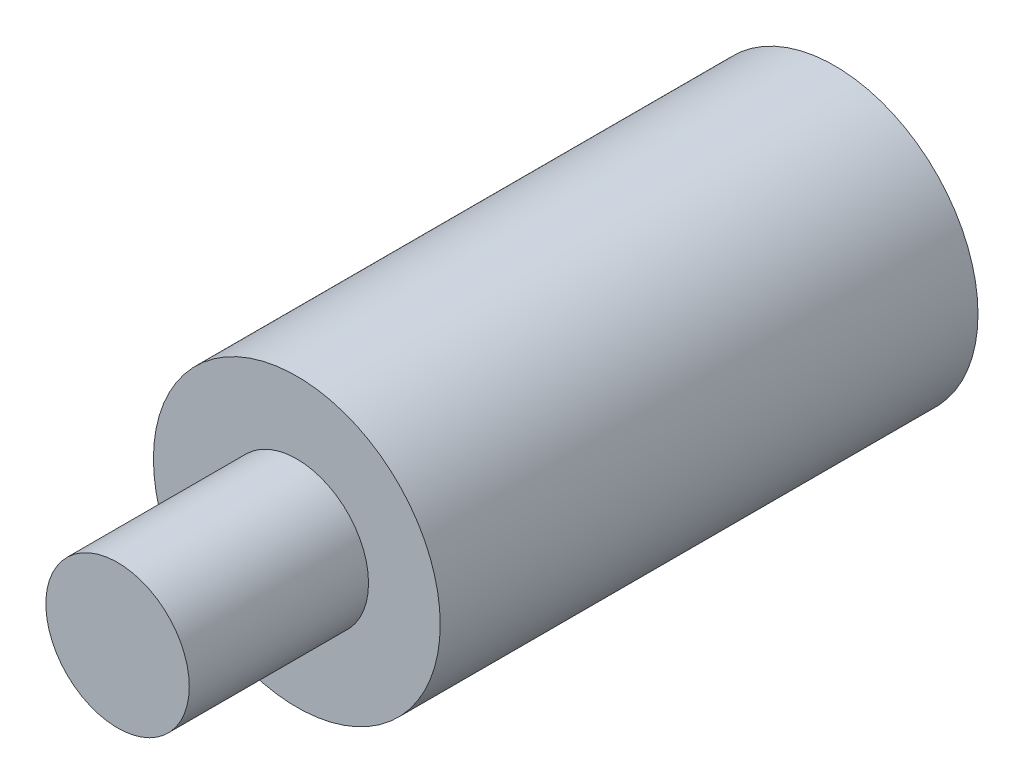
ISO-10303-21;
HEADER;
FILE_DESCRIPTION(('STEP AP214'),'2;1');
FILE_NAME('part.step','',(''),(''),'','','');
FILE_SCHEMA(('AUTOMOTIVE_DESIGN { 1 0 10303 214 1 1 1 1 }'));
ENDSEC;
DATA;
#1=APPLICATION_CONTEXT('core data for automotive mechanical design processes');
#2=APPLICATION_PROTOCOL_DEFINITION('international standard','automotive_design',2000,#1);
#3=PRODUCT_CONTEXT('',#1,'mechanical');
#4=PRODUCT('Part','Part','',(#3));
#5=PRODUCT_RELATED_PRODUCT_CATEGORY('part','',(#4));
#6=PRODUCT_DEFINITION_FORMATION('','',#4);
#7=PRODUCT_DEFINITION_CONTEXT('part definition',#1,'design');
#8=PRODUCT_DEFINITION('design','',#6,#7);
#9=PRODUCT_DEFINITION_SHAPE('','',#8);
#10=(LENGTH_UNIT() NAMED_UNIT(*) SI_UNIT(.MILLI.,.METRE.));
#11=(NAMED_UNIT(*) PLANE_ANGLE_UNIT() SI_UNIT($,.RADIAN.));
#12=(NAMED_UNIT(*) SI_UNIT($,.STERADIAN.) SOLID_ANGLE_UNIT());
#13=UNCERTAINTY_MEASURE_WITH_UNIT(LENGTH_MEASURE(1.E-05),#10,'distance_accuracy_value','');
#14=(GEOMETRIC_REPRESENTATION_CONTEXT(3) GLOBAL_UNCERTAINTY_ASSIGNED_CONTEXT((#13)) GLOBAL_UNIT_ASSIGNED_CONTEXT((#10,
#11,#12)) REPRESENTATION_CONTEXT('',''));
#15=CARTESIAN_POINT('',(0.,0.,0.));
#16=DIRECTION('',(0.,0.,1.));
#17=DIRECTION('',(1.,0.,0.));
#18=AXIS2_PLACEMENT_3D('',#15,#16,#17);
#19=CARTESIAN_POINT('',(0.,0.,15.));
#20=DIRECTION('',(0.,0.,-1.));
#21=DIRECTION('',(-1.,0.,0.));
#22=AXIS2_PLACEMENT_3D('',#19,#20,#21);
#23=CYLINDRICAL_SURFACE('',#22,4.);
#24=CARTESIAN_POINT('',(0.,0.,15.));
#25=DIRECTION('',(0.,0.,1.));
#26=DIRECTION('',(1.,0.,0.));
#27=AXIS2_PLACEMENT_3D('',#24,#25,#26);
#28=CIRCLE('',#27,4.);
#29=CARTESIAN_POINT('',(4.,0.,15.));
#30=VERTEX_POINT('',#29);
#31=EDGE_CURVE('E46',#30,#30,#28,.T.);
#32=ORIENTED_EDGE('',*,*,#31,.F.);
#33=EDGE_LOOP('',(#32));
#34=FACE_BOUND('',#33,.T.);
#35=CARTESIAN_POINT('',(0.,0.,0.));
#36=DIRECTION('',(0.,0.,1.));
#37=DIRECTION('',(1.,0.,0.));
#38=AXIS2_PLACEMENT_3D('',#35,#36,#37);
#39=CIRCLE('',#38,4.);
#40=CARTESIAN_POINT('',(4.,0.,0.));
#41=VERTEX_POINT('',#40);
#42=EDGE_CURVE('E42',#41,#41,#39,.T.);
#43=ORIENTED_EDGE('',*,*,#42,.T.);
#44=EDGE_LOOP('',(#43));
#45=FACE_BOUND('',#44,.T.);
#46=ADVANCED_FACE('F39',(#34,#45),#23,.T.);
#47=CARTESIAN_POINT('',(0.,0.,15.));
#48=DIRECTION('',(0.,0.,1.));
#49=DIRECTION('',(1.,0.,0.));
#50=AXIS2_PLACEMENT_3D('',#47,#48,#49);
#51=PLANE('',#50);
#52=CARTESIAN_POINT('',(0.,0.,15.));
#53=DIRECTION('',(0.,0.,1.));
#54=DIRECTION('',(1.,0.,0.));
#55=AXIS2_PLACEMENT_3D('',#52,#53,#54);
#56=CIRCLE('',#55,2.);
#57=CARTESIAN_POINT('',(2.,0.,15.));
#58=VERTEX_POINT('',#57);
#59=EDGE_CURVE('E10',#58,#58,#56,.T.);
#60=ORIENTED_EDGE('',*,*,#59,.F.);
#61=EDGE_LOOP('',(#60));
#62=FACE_BOUND('',#61,.T.);
#63=ORIENTED_EDGE('',*,*,#31,.T.);
#64=EDGE_LOOP('',(#63));
#65=FACE_BOUND('',#64,.T.);
#66=ADVANCED_FACE('F75',(#62,#65),#51,.T.);
#67=CARTESIAN_POINT('',(0.,0.,0.));
#68=DIRECTION('',(0.,0.,1.));
#69=DIRECTION('',(1.,0.,0.));
#70=AXIS2_PLACEMENT_3D('',#67,#68,#69);
#71=PLANE('',#70);
#72=CARTESIAN_POINT('',(0.,0.,0.));
#73=DIRECTION('',(0.,0.,-1.));
#74=DIRECTION('',(-1.,0.,0.));
#75=AXIS2_PLACEMENT_3D('',#72,#73,#74);
#76=CIRCLE('',#75,1.5);
#77=CARTESIAN_POINT('',(-1.5,0.,0.));
#78=VERTEX_POINT('',#77);
#79=EDGE_CURVE('E56',#78,#78,#76,.T.);
#80=ORIENTED_EDGE('',*,*,#79,.F.);
#81=EDGE_LOOP('',(#80));
#82=FACE_BOUND('',#81,.T.);
#83=ORIENTED_EDGE('',*,*,#42,.F.);
#84=EDGE_LOOP('',(#83));
#85=FACE_BOUND('',#84,.T.);
#86=ADVANCED_FACE('F71',(#82,#85),#71,.F.);
#87=CARTESIAN_POINT('',(0.,0.,20.));
#88=DIRECTION('',(0.,0.,-1.));
#89=DIRECTION('',(-1.,0.,0.));
#90=AXIS2_PLACEMENT_3D('',#87,#88,#89);
#91=CYLINDRICAL_SURFACE('',#90,2.);
#92=CARTESIAN_POINT('',(0.,0.,20.));
#93=DIRECTION('',(0.,0.,1.));
#94=DIRECTION('',(1.,0.,0.));
#95=AXIS2_PLACEMENT_3D('',#92,#93,#94);
#96=CIRCLE('',#95,2.);
#97=CARTESIAN_POINT('',(2.,0.,20.));
#98=VERTEX_POINT('',#97);
#99=EDGE_CURVE('E52',#98,#98,#96,.T.);
#100=ORIENTED_EDGE('',*,*,#99,.F.);
#101=EDGE_LOOP('',(#100));
#102=FACE_BOUND('',#101,.T.);
#103=ORIENTED_EDGE('',*,*,#59,.T.);
#104=EDGE_LOOP('',(#103));
#105=FACE_BOUND('',#104,.T.);
#106=ADVANCED_FACE('F74',(#102,#105),#91,.T.);
#107=CARTESIAN_POINT('',(0.,0.,20.));
#108=DIRECTION('',(0.,0.,1.));
#109=DIRECTION('',(1.,0.,0.));
#110=AXIS2_PLACEMENT_3D('',#107,#108,#109);
#111=PLANE('',#110);
#112=ORIENTED_EDGE('',*,*,#99,.T.);
#113=EDGE_LOOP('',(#112));
#114=FACE_BOUND('',#113,.T.);
#115=ADVANCED_FACE('F67',(#114),#111,.T.);
#116=CARTESIAN_POINT('',(0.,0.,10.));
#117=DIRECTION('',(0.,0.,-1.));
#118=DIRECTION('',(-1.,0.,0.));
#119=AXIS2_PLACEMENT_3D('',#116,#117,#118);
#120=CYLINDRICAL_SURFACE('',#119,1.5);
#121=CARTESIAN_POINT('',(0.,0.,10.));
#122=DIRECTION('',(0.,0.,-1.));
#123=DIRECTION('',(-1.,0.,0.));
#124=AXIS2_PLACEMENT_3D('',#121,#122,#123);
#125=CIRCLE('',#124,1.5);
#126=CARTESIAN_POINT('',(-1.5,0.,10.));
#127=VERTEX_POINT('',#126);
#128=EDGE_CURVE('E55',#127,#127,#125,.T.);
#129=ORIENTED_EDGE('',*,*,#128,.F.);
#130=EDGE_LOOP('',(#129));
#131=FACE_BOUND('',#130,.T.);
#132=ORIENTED_EDGE('',*,*,#79,.T.);
#133=EDGE_LOOP('',(#132));
#134=FACE_BOUND('',#133,.T.);
#135=ADVANCED_FACE('F64',(#131,#134),#120,.F.);
#136=CARTESIAN_POINT('',(0.,0.,10.));
#137=DIRECTION('',(0.,0.,-1.));
#138=DIRECTION('',(-1.,0.,0.));
#139=AXIS2_PLACEMENT_3D('',#136,#137,#138);
#140=PLANE('',#139);
#141=ORIENTED_EDGE('',*,*,#128,.T.);
#142=EDGE_LOOP('',(#141));
#143=FACE_BOUND('',#142,.T.);
#144=ADVANCED_FACE('F62',(#143),#140,.T.);
#145=CLOSED_SHELL('',(#46,#66,#86,#106,#115,#135,#144));
#146=MANIFOLD_SOLID_BREP('B2',#145);
#147=ADVANCED_BREP_SHAPE_REPRESENTATION('',(#18,#146),#14);
#148=SHAPE_DEFINITION_REPRESENTATION(#9,#147);
ENDSEC;
END-ISO-10303-21;
